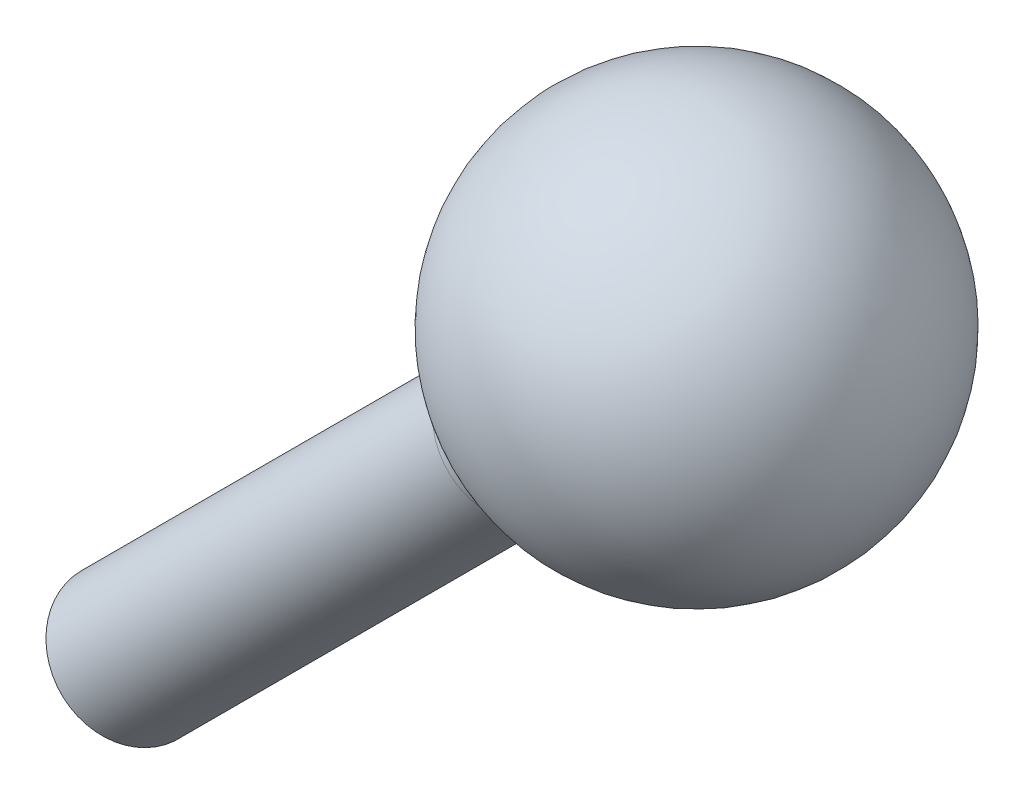
ISO-10303-21;
HEADER;
FILE_DESCRIPTION(('STEP AP214'),'2;1');
FILE_NAME('part.step','',(''),(''),'','','');
FILE_SCHEMA(('AUTOMOTIVE_DESIGN { 1 0 10303 214 1 1 1 1 }'));
ENDSEC;
DATA;
#1=APPLICATION_CONTEXT('core data for automotive mechanical design processes');
#2=APPLICATION_PROTOCOL_DEFINITION('international standard','automotive_design',2000,#1);
#3=PRODUCT_CONTEXT('',#1,'mechanical');
#4=PRODUCT('Part','Part','',(#3));
#5=PRODUCT_RELATED_PRODUCT_CATEGORY('part','',(#4));
#6=PRODUCT_DEFINITION_FORMATION('','',#4);
#7=PRODUCT_DEFINITION_CONTEXT('part definition',#1,'design');
#8=PRODUCT_DEFINITION('design','',#6,#7);
#9=PRODUCT_DEFINITION_SHAPE('','',#8);
#10=(LENGTH_UNIT() NAMED_UNIT(*) SI_UNIT(.MILLI.,.METRE.));
#11=(NAMED_UNIT(*) PLANE_ANGLE_UNIT() SI_UNIT($,.RADIAN.));
#12=(NAMED_UNIT(*) SI_UNIT($,.STERADIAN.) SOLID_ANGLE_UNIT());
#13=UNCERTAINTY_MEASURE_WITH_UNIT(LENGTH_MEASURE(1.E-05),#10,'distance_accuracy_value','');
#14=(GEOMETRIC_REPRESENTATION_CONTEXT(3) GLOBAL_UNCERTAINTY_ASSIGNED_CONTEXT((#13)) GLOBAL_UNIT_ASSIGNED_CONTEXT((#10,
#11,#12)) REPRESENTATION_CONTEXT('',''));
#15=CARTESIAN_POINT('',(0.,0.,0.));
#16=DIRECTION('',(0.,0.,1.));
#17=DIRECTION('',(1.,0.,0.));
#18=AXIS2_PLACEMENT_3D('',#15,#16,#17);
#19=CARTESIAN_POINT('',(-5.,-52.1002726720865,0.));
#20=DIRECTION('',(0.,-1.,0.));
#21=DIRECTION('',(0.,0.,-1.));
#22=AXIS2_PLACEMENT_3D('',#19,#20,#21);
#23=SPHERICAL_SURFACE('',#22,17.4);
#24=CARTESIAN_POINT('',(-5.,-52.1002726720865,0.));
#25=DIRECTION('',(0.707106781186548,0.707106781186548,0.));
#26=DIRECTION('',(-0.707106781186548,0.707106781186548,0.));
#27=AXIS2_PLACEMENT_3D('',#24,#25,#26);
#28=SPHERICAL_SURFACE('',#27,17.4);
#29=CARTESIAN_POINT('',(-14.9880562164413,-62.0883288885277,0.));
#30=DIRECTION('',(0.707106781186547,0.707106781186547,0.));
#31=DIRECTION('',(-0.707106781186548,0.707106781186548,0.));
#32=AXIS2_PLACEMENT_3D('',#29,#30,#31);
#33=CIRCLE('',#32,10.1605839416058);
#34=CARTESIAN_POINT('',(-22.1726740223659,-54.9037110826031,0.));
#35=VERTEX_POINT('',#34);
#36=EDGE_CURVE('E10',#35,#35,#33,.T.);
#37=ORIENTED_EDGE('',*,*,#36,.T.);
#38=EDGE_LOOP('',(#37));
#39=FACE_BOUND('',#38,.T.);
#40=ADVANCED_FACE('F31',(#39),#28,.T.);
#41=CARTESIAN_POINT('',(-54.4974746830583,-101.597747355145,0.));
#42=DIRECTION('',(0.707106781186548,0.707106781186548,0.));
#43=DIRECTION('',(-0.707106781186548,0.707106781186548,0.));
#44=AXIS2_PLACEMENT_3D('',#41,#42,#43);
#45=CYLINDRICAL_SURFACE('',#44,6.);
#46=CARTESIAN_POINT('',(-20.7283184097983,-67.8285910818847,0.));
#47=DIRECTION('',(0.707106781186547,0.707106781186547,0.));
#48=DIRECTION('',(-0.707106781186548,0.707106781186548,0.));
#49=AXIS2_PLACEMENT_3D('',#46,#47,#48);
#50=CIRCLE('',#49,6.);
#51=CARTESIAN_POINT('',(-24.9709590969176,-63.5859503947655,0.));
#52=VERTEX_POINT('',#51);
#53=EDGE_CURVE('E38',#52,#52,#50,.F.);
#54=ORIENTED_EDGE('',*,*,#53,.T.);
#55=EDGE_LOOP('',(#54));
#56=FACE_BOUND('',#55,.T.);
#57=CARTESIAN_POINT('',(-54.4974746830583,-101.597747355145,0.));
#58=DIRECTION('',(0.707106781186548,0.707106781186548,0.));
#59=DIRECTION('',(-0.707106781186548,0.707106781186548,0.));
#60=AXIS2_PLACEMENT_3D('',#57,#58,#59);
#61=CIRCLE('',#60,6.);
#62=CARTESIAN_POINT('',(-58.7401153701776,-97.3551066680255,0.));
#63=VERTEX_POINT('',#62);
#64=EDGE_CURVE('E42',#63,#63,#61,.T.);
#65=ORIENTED_EDGE('',*,*,#64,.T.);
#66=EDGE_LOOP('',(#65));
#67=FACE_BOUND('',#66,.T.);
#68=ADVANCED_FACE('F49',(#56,#67),#45,.T.);
#69=CARTESIAN_POINT('',(-54.4974746830583,-101.597747355145,0.));
#70=DIRECTION('',(0.707106781186548,0.707106781186548,0.));
#71=DIRECTION('',(-0.707106781186548,0.707106781186548,0.));
#72=AXIS2_PLACEMENT_3D('',#69,#70,#71);
#73=PLANE('',#72);
#74=ORIENTED_EDGE('',*,*,#64,.F.);
#75=EDGE_LOOP('',(#74));
#76=FACE_BOUND('',#75,.T.);
#77=ADVANCED_FACE('F51',(#76),#73,.F.);
#78=CARTESIAN_POINT('',(-20.7283184097983,-67.8285910818848,0.));
#79=DIRECTION('',(0.707106781186547,0.707106781186547,0.));
#80=DIRECTION('',(-0.707106781186548,0.707106781186548,0.));
#81=AXIS2_PLACEMENT_3D('',#78,#79,#80);
#82=TOROIDAL_SURFACE('',#81,16.,10.);
#83=ORIENTED_EDGE('',*,*,#36,.F.);
#84=EDGE_LOOP('',(#83));
#85=FACE_BOUND('',#84,.T.);
#86=ORIENTED_EDGE('',*,*,#53,.F.);
#87=EDGE_LOOP('',(#86));
#88=FACE_BOUND('',#87,.T.);
#89=ADVANCED_FACE('F33',(#85,#88),#82,.F.);
#90=CLOSED_SHELL('',(#40,#68,#77,#89));
#91=MANIFOLD_SOLID_BREP('B2',#90);
#92=ADVANCED_BREP_SHAPE_REPRESENTATION('',(#18,#91),#14);
#93=SHAPE_DEFINITION_REPRESENTATION(#9,#92);
ENDSEC;
END-ISO-10303-21;
